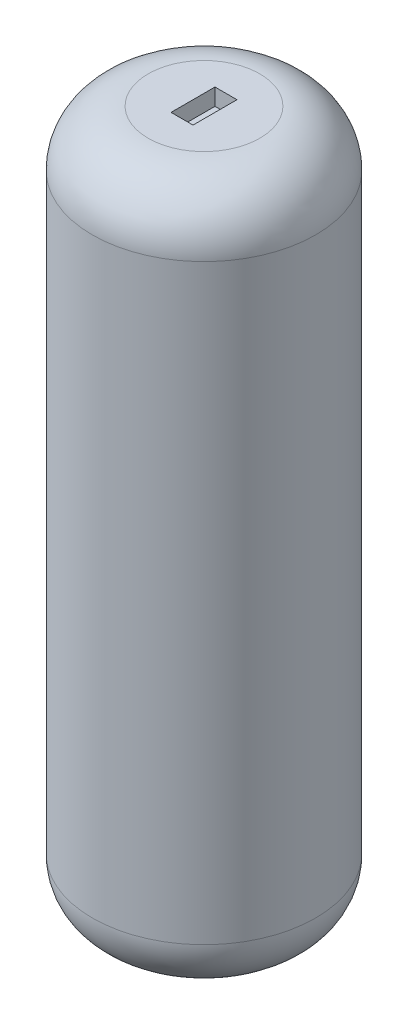
ISO-10303-21;
HEADER;
FILE_DESCRIPTION(('STEP AP214'),'2;1');
FILE_NAME('part.step','',(''),(''),'','','');
FILE_SCHEMA(('AUTOMOTIVE_DESIGN { 1 0 10303 214 1 1 1 1 }'));
ENDSEC;
DATA;
#1=APPLICATION_CONTEXT('core data for automotive mechanical design processes');
#2=APPLICATION_PROTOCOL_DEFINITION('international standard','automotive_design',2000,#1);
#3=PRODUCT_CONTEXT('',#1,'mechanical');
#4=PRODUCT('Part','Part','',(#3));
#5=PRODUCT_RELATED_PRODUCT_CATEGORY('part','',(#4));
#6=PRODUCT_DEFINITION_FORMATION('','',#4);
#7=PRODUCT_DEFINITION_CONTEXT('part definition',#1,'design');
#8=PRODUCT_DEFINITION('design','',#6,#7);
#9=PRODUCT_DEFINITION_SHAPE('','',#8);
#10=(LENGTH_UNIT() NAMED_UNIT(*) SI_UNIT(.MILLI.,.METRE.));
#11=(NAMED_UNIT(*) PLANE_ANGLE_UNIT() SI_UNIT($,.RADIAN.));
#12=(NAMED_UNIT(*) SI_UNIT($,.STERADIAN.) SOLID_ANGLE_UNIT());
#13=UNCERTAINTY_MEASURE_WITH_UNIT(LENGTH_MEASURE(1.E-05),#10,'distance_accuracy_value','');
#14=(GEOMETRIC_REPRESENTATION_CONTEXT(3) GLOBAL_UNCERTAINTY_ASSIGNED_CONTEXT((#13)) GLOBAL_UNIT_ASSIGNED_CONTEXT((#10,
#11,#12)) REPRESENTATION_CONTEXT('',''));
#15=CARTESIAN_POINT('',(0.,0.,0.));
#16=DIRECTION('',(0.,0.,1.));
#17=DIRECTION('',(1.,0.,0.));
#18=AXIS2_PLACEMENT_3D('',#15,#16,#17);
#19=CARTESIAN_POINT('',(0.,320.,0.));
#20=DIRECTION('',(0.,-1.,0.));
#21=DIRECTION('',(0.,0.,-1.));
#22=AXIS2_PLACEMENT_3D('',#19,#20,#21);
#23=CYLINDRICAL_SURFACE('',#22,50.8);
#24=CARTESIAN_POINT('',(0.,25.4,0.));
#25=DIRECTION('',(0.,1.,0.));
#26=DIRECTION('',(0.,0.,1.));
#27=AXIS2_PLACEMENT_3D('',#24,#25,#26);
#28=CIRCLE('',#27,50.8);
#29=CARTESIAN_POINT('',(0.,25.4,50.8));
#30=VERTEX_POINT('',#29);
#31=EDGE_CURVE('E144',#30,#30,#28,.T.);
#32=ORIENTED_EDGE('',*,*,#31,.T.);
#33=EDGE_LOOP('',(#32));
#34=FACE_BOUND('',#33,.T.);
#35=CARTESIAN_POINT('',(0.,294.6,0.));
#36=DIRECTION('',(0.,1.,0.));
#37=DIRECTION('',(0.,0.,1.));
#38=AXIS2_PLACEMENT_3D('',#35,#36,#37);
#39=CIRCLE('',#38,50.8);
#40=CARTESIAN_POINT('',(0.,294.6,50.8));
#41=VERTEX_POINT('',#40);
#42=EDGE_CURVE('E136',#41,#41,#39,.F.);
#43=ORIENTED_EDGE('',*,*,#42,.T.);
#44=EDGE_LOOP('',(#43));
#45=FACE_BOUND('',#44,.T.);
#46=ADVANCED_FACE('F47',(#34,#45),#23,.T.);
#47=CARTESIAN_POINT('',(0.,320.,0.));
#48=DIRECTION('',(0.,1.,0.));
#49=DIRECTION('',(0.,0.,1.));
#50=AXIS2_PLACEMENT_3D('',#47,#48,#49);
#51=PLANE('',#50);
#52=DIRECTION('',(0.,0.,-1.));
#53=VECTOR('',#52,1.);
#54=CARTESIAN_POINT('',(5.,320.,10.));
#55=LINE('',#54,#53);
#56=CARTESIAN_POINT('',(5.,320.,10.));
#57=VERTEX_POINT('',#56);
#58=CARTESIAN_POINT('',(5.,320.,-10.));
#59=VERTEX_POINT('',#58);
#60=EDGE_CURVE('E63',#57,#59,#55,.T.);
#61=ORIENTED_EDGE('',*,*,#60,.F.);
#62=DIRECTION('',(1.,0.,0.));
#63=VECTOR('',#62,1.);
#64=CARTESIAN_POINT('',(-5.,320.,10.));
#65=LINE('',#64,#63);
#66=CARTESIAN_POINT('',(-5.,320.,10.));
#67=VERTEX_POINT('',#66);
#68=EDGE_CURVE('E118',#67,#57,#65,.T.);
#69=ORIENTED_EDGE('',*,*,#68,.F.);
#70=DIRECTION('',(0.,0.,1.));
#71=VECTOR('',#70,1.);
#72=CARTESIAN_POINT('',(-5.,320.,10.));
#73=LINE('',#72,#71);
#74=CARTESIAN_POINT('',(-5.,320.,-10.));
#75=VERTEX_POINT('',#74);
#76=EDGE_CURVE('E129',#75,#67,#73,.T.);
#77=ORIENTED_EDGE('',*,*,#76,.F.);
#78=DIRECTION('',(-1.,0.,0.));
#79=VECTOR('',#78,1.);
#80=CARTESIAN_POINT('',(-5.,320.,-10.));
#81=LINE('',#80,#79);
#82=EDGE_CURVE('E98',#59,#75,#81,.T.);
#83=ORIENTED_EDGE('',*,*,#82,.F.);
#84=EDGE_LOOP('',(#61,#69,#77,#83));
#85=FACE_BOUND('',#84,.T.);
#86=CARTESIAN_POINT('',(0.,320.,0.));
#87=DIRECTION('',(0.,1.,0.));
#88=DIRECTION('',(0.,0.,1.));
#89=AXIS2_PLACEMENT_3D('',#86,#87,#88);
#90=CIRCLE('',#89,25.4);
#91=CARTESIAN_POINT('',(0.,320.,25.4));
#92=VERTEX_POINT('',#91);
#93=EDGE_CURVE('E11',#92,#92,#90,.T.);
#94=ORIENTED_EDGE('',*,*,#93,.T.);
#95=EDGE_LOOP('',(#94));
#96=FACE_BOUND('',#95,.T.);
#97=ADVANCED_FACE('F160',(#85,#96),#51,.T.);
#98=CARTESIAN_POINT('',(0.,0.,0.));
#99=DIRECTION('',(0.,1.,0.));
#100=DIRECTION('',(0.,0.,1.));
#101=AXIS2_PLACEMENT_3D('',#98,#99,#100);
#102=PLANE('',#101);
#103=CARTESIAN_POINT('',(0.,0.,0.));
#104=DIRECTION('',(0.,-1.,0.));
#105=DIRECTION('',(0.,0.,-1.));
#106=AXIS2_PLACEMENT_3D('',#103,#104,#105);
#107=CIRCLE('',#106,19.05);
#108=CARTESIAN_POINT('',(0.,0.,-19.05));
#109=VERTEX_POINT('',#108);
#110=EDGE_CURVE('E202',#109,#109,#107,.T.);
#111=ORIENTED_EDGE('',*,*,#110,.F.);
#112=EDGE_LOOP('',(#111));
#113=FACE_BOUND('',#112,.T.);
#114=CARTESIAN_POINT('',(0.,0.,0.));
#115=DIRECTION('',(0.,1.,0.));
#116=DIRECTION('',(0.,0.,1.));
#117=AXIS2_PLACEMENT_3D('',#114,#115,#116);
#118=CIRCLE('',#117,25.4);
#119=CARTESIAN_POINT('',(0.,0.,25.4));
#120=VERTEX_POINT('',#119);
#121=EDGE_CURVE('E56',#120,#120,#118,.F.);
#122=ORIENTED_EDGE('',*,*,#121,.T.);
#123=EDGE_LOOP('',(#122));
#124=FACE_BOUND('',#123,.T.);
#125=ADVANCED_FACE('F151',(#113,#124),#102,.F.);
#126=CARTESIAN_POINT('',(0.,25.4,0.));
#127=DIRECTION('',(0.,1.,0.));
#128=DIRECTION('',(0.,0.,1.));
#129=AXIS2_PLACEMENT_3D('',#126,#127,#128);
#130=DEGENERATE_TOROIDAL_SURFACE('',#129,25.4,25.4,.T.);
#131=ORIENTED_EDGE('',*,*,#121,.F.);
#132=EDGE_LOOP('',(#131));
#133=FACE_BOUND('',#132,.T.);
#134=ORIENTED_EDGE('',*,*,#31,.F.);
#135=EDGE_LOOP('',(#134));
#136=FACE_BOUND('',#135,.T.);
#137=ADVANCED_FACE('F153',(#133,#136),#130,.T.);
#138=CARTESIAN_POINT('',(0.,294.6,0.));
#139=DIRECTION('',(0.,1.,0.));
#140=DIRECTION('',(0.,0.,1.));
#141=AXIS2_PLACEMENT_3D('',#138,#139,#140);
#142=DEGENERATE_TOROIDAL_SURFACE('',#141,25.4,25.4,.T.);
#143=ORIENTED_EDGE('',*,*,#42,.F.);
#144=EDGE_LOOP('',(#143));
#145=FACE_BOUND('',#144,.T.);
#146=ORIENTED_EDGE('',*,*,#93,.F.);
#147=EDGE_LOOP('',(#146));
#148=FACE_BOUND('',#147,.T.);
#149=ADVANCED_FACE('F49',(#145,#148),#142,.T.);
#150=CARTESIAN_POINT('',(5.,312.38,10.));
#151=DIRECTION('',(1.,0.,0.));
#152=DIRECTION('',(0.,0.,-1.));
#153=AXIS2_PLACEMENT_3D('',#150,#151,#152);
#154=PLANE('',#153);
#155=ORIENTED_EDGE('',*,*,#60,.T.);
#156=DIRECTION('',(0.,1.,0.));
#157=VECTOR('',#156,1.);
#158=CARTESIAN_POINT('',(5.,312.38,-10.));
#159=LINE('',#158,#157);
#160=CARTESIAN_POINT('',(5.,312.38,-10.));
#161=VERTEX_POINT('',#160);
#162=EDGE_CURVE('E86',#161,#59,#159,.T.);
#163=ORIENTED_EDGE('',*,*,#162,.F.);
#164=DIRECTION('',(0.,0.,-1.));
#165=VECTOR('',#164,1.);
#166=CARTESIAN_POINT('',(5.,312.38,10.));
#167=LINE('',#166,#165);
#168=CARTESIAN_POINT('',(5.,312.38,10.));
#169=VERTEX_POINT('',#168);
#170=EDGE_CURVE('E114',#169,#161,#167,.T.);
#171=ORIENTED_EDGE('',*,*,#170,.F.);
#172=DIRECTION('',(0.,1.,0.));
#173=VECTOR('',#172,1.);
#174=CARTESIAN_POINT('',(5.,312.38,10.));
#175=LINE('',#174,#173);
#176=EDGE_CURVE('E71',#169,#57,#175,.T.);
#177=ORIENTED_EDGE('',*,*,#176,.T.);
#178=EDGE_LOOP('',(#155,#163,#171,#177));
#179=FACE_BOUND('',#178,.T.);
#180=ADVANCED_FACE('F166',(#179),#154,.F.);
#181=CARTESIAN_POINT('',(-5.,312.38,10.));
#182=DIRECTION('',(0.,0.,1.));
#183=DIRECTION('',(1.,0.,0.));
#184=AXIS2_PLACEMENT_3D('',#181,#182,#183);
#185=PLANE('',#184);
#186=ORIENTED_EDGE('',*,*,#68,.T.);
#187=ORIENTED_EDGE('',*,*,#176,.F.);
#188=DIRECTION('',(1.,0.,0.));
#189=VECTOR('',#188,1.);
#190=CARTESIAN_POINT('',(-5.,312.38,10.));
#191=LINE('',#190,#189);
#192=CARTESIAN_POINT('',(-5.,312.38,10.));
#193=VERTEX_POINT('',#192);
#194=EDGE_CURVE('E111',#193,#169,#191,.T.);
#195=ORIENTED_EDGE('',*,*,#194,.F.);
#196=DIRECTION('',(0.,1.,0.));
#197=VECTOR('',#196,1.);
#198=CARTESIAN_POINT('',(-5.,312.38,10.));
#199=LINE('',#198,#197);
#200=EDGE_CURVE('E103',#193,#67,#199,.T.);
#201=ORIENTED_EDGE('',*,*,#200,.T.);
#202=EDGE_LOOP('',(#186,#187,#195,#201));
#203=FACE_BOUND('',#202,.T.);
#204=ADVANCED_FACE('F181',(#203),#185,.F.);
#205=CARTESIAN_POINT('',(-5.,312.38,10.));
#206=DIRECTION('',(-1.,0.,0.));
#207=DIRECTION('',(0.,0.,1.));
#208=AXIS2_PLACEMENT_3D('',#205,#206,#207);
#209=PLANE('',#208);
#210=ORIENTED_EDGE('',*,*,#76,.T.);
#211=ORIENTED_EDGE('',*,*,#200,.F.);
#212=DIRECTION('',(0.,0.,1.));
#213=VECTOR('',#212,1.);
#214=CARTESIAN_POINT('',(-5.,312.38,10.));
#215=LINE('',#214,#213);
#216=CARTESIAN_POINT('',(-5.,312.38,-10.));
#217=VERTEX_POINT('',#216);
#218=EDGE_CURVE('E106',#217,#193,#215,.T.);
#219=ORIENTED_EDGE('',*,*,#218,.F.);
#220=DIRECTION('',(0.,1.,0.));
#221=VECTOR('',#220,1.);
#222=CARTESIAN_POINT('',(-5.,312.38,-10.));
#223=LINE('',#222,#221);
#224=EDGE_CURVE('E91',#217,#75,#223,.T.);
#225=ORIENTED_EDGE('',*,*,#224,.T.);
#226=EDGE_LOOP('',(#210,#211,#219,#225));
#227=FACE_BOUND('',#226,.T.);
#228=ADVANCED_FACE('F107',(#227),#209,.F.);
#229=CARTESIAN_POINT('',(-5.,312.38,-10.));
#230=DIRECTION('',(0.,0.,-1.));
#231=DIRECTION('',(-1.,0.,0.));
#232=AXIS2_PLACEMENT_3D('',#229,#230,#231);
#233=PLANE('',#232);
#234=ORIENTED_EDGE('',*,*,#82,.T.);
#235=ORIENTED_EDGE('',*,*,#224,.F.);
#236=DIRECTION('',(-1.,0.,0.));
#237=VECTOR('',#236,1.);
#238=CARTESIAN_POINT('',(-5.,312.38,-10.));
#239=LINE('',#238,#237);
#240=EDGE_CURVE('E95',#161,#217,#239,.T.);
#241=ORIENTED_EDGE('',*,*,#240,.F.);
#242=ORIENTED_EDGE('',*,*,#162,.T.);
#243=EDGE_LOOP('',(#234,#235,#241,#242));
#244=FACE_BOUND('',#243,.T.);
#245=ADVANCED_FACE('F93',(#244),#233,.F.);
#246=CARTESIAN_POINT('',(0.,312.38,0.));
#247=DIRECTION('',(0.,-1.,0.));
#248=DIRECTION('',(0.,0.,-1.));
#249=AXIS2_PLACEMENT_3D('',#246,#247,#248);
#250=PLANE('',#249);
#251=ORIENTED_EDGE('',*,*,#170,.T.);
#252=ORIENTED_EDGE('',*,*,#240,.T.);
#253=ORIENTED_EDGE('',*,*,#218,.T.);
#254=ORIENTED_EDGE('',*,*,#194,.T.);
#255=EDGE_LOOP('',(#251,#252,#253,#254));
#256=FACE_BOUND('',#255,.T.);
#257=ADVANCED_FACE('F113',(#256),#250,.F.);
#258=CARTESIAN_POINT('',(0.,2.54,0.));
#259=DIRECTION('',(0.,-1.,0.));
#260=DIRECTION('',(0.,0.,-1.));
#261=AXIS2_PLACEMENT_3D('',#258,#259,#260);
#262=CYLINDRICAL_SURFACE('',#261,19.05);
#263=CARTESIAN_POINT('',(0.,2.54,0.));
#264=DIRECTION('',(0.,-1.,0.));
#265=DIRECTION('',(0.,0.,-1.));
#266=AXIS2_PLACEMENT_3D('',#263,#264,#265);
#267=CIRCLE('',#266,19.05);
#268=CARTESIAN_POINT('',(0.,2.54,-19.05));
#269=VERTEX_POINT('',#268);
#270=EDGE_CURVE('E126',#269,#269,#267,.T.);
#271=ORIENTED_EDGE('',*,*,#270,.F.);
#272=EDGE_LOOP('',(#271));
#273=FACE_BOUND('',#272,.T.);
#274=ORIENTED_EDGE('',*,*,#110,.T.);
#275=EDGE_LOOP('',(#274));
#276=FACE_BOUND('',#275,.T.);
#277=ADVANCED_FACE('F190',(#273,#276),#262,.F.);
#278=CARTESIAN_POINT('',(0.,2.54,0.));
#279=DIRECTION('',(0.,-1.,0.));
#280=DIRECTION('',(0.,0.,-1.));
#281=AXIS2_PLACEMENT_3D('',#278,#279,#280);
#282=PLANE('',#281);
#283=ORIENTED_EDGE('',*,*,#270,.T.);
#284=EDGE_LOOP('',(#283));
#285=FACE_BOUND('',#284,.T.);
#286=ADVANCED_FACE('F193',(#285),#282,.T.);
#287=CLOSED_SHELL('',(#46,#97,#125,#137,#149,#180,#204,#228,#245,#257,#277,#286));
#288=MANIFOLD_SOLID_BREP('B2',#287);
#289=ADVANCED_BREP_SHAPE_REPRESENTATION('',(#18,#288),#14);
#290=SHAPE_DEFINITION_REPRESENTATION(#9,#289);
ENDSEC;
END-ISO-10303-21;
